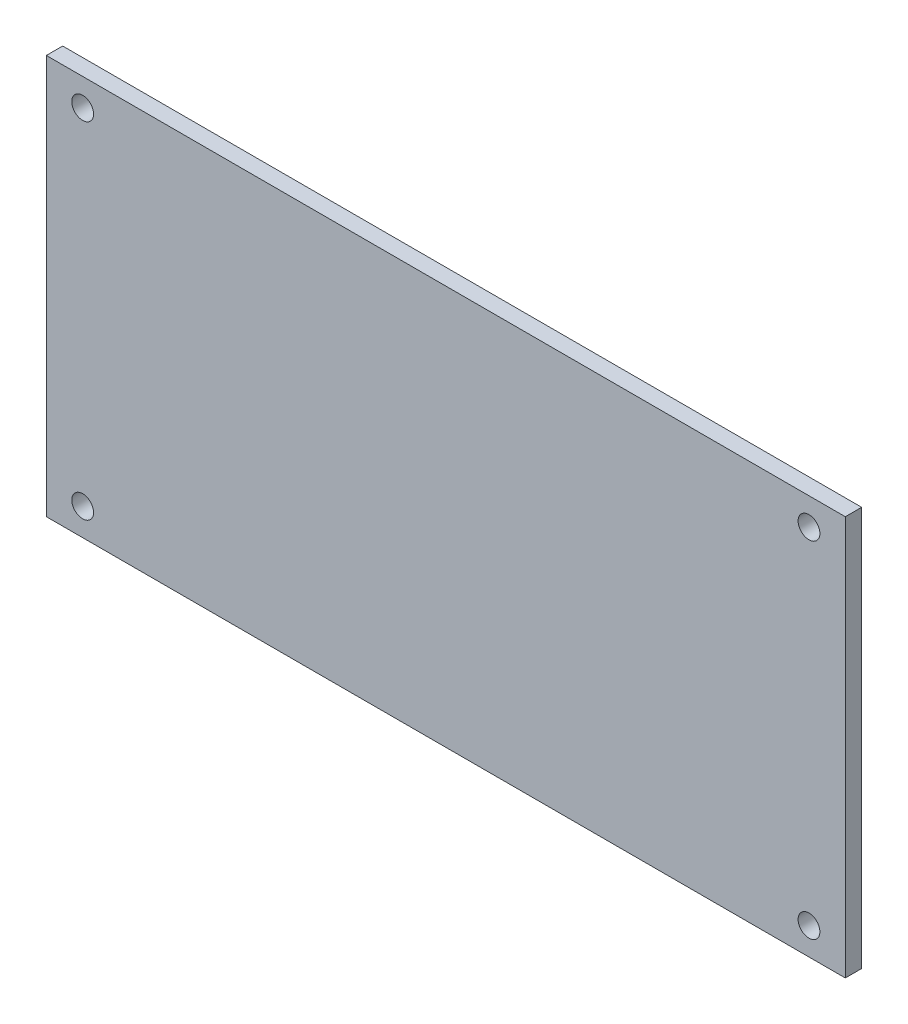
ISO-10303-21;
HEADER;
FILE_DESCRIPTION(('STEP AP214'),'2;1');
FILE_NAME('part.step','',(''),(''),'','','');
FILE_SCHEMA(('AUTOMOTIVE_DESIGN { 1 0 10303 214 1 1 1 1 }'));
ENDSEC;
DATA;
#1=APPLICATION_CONTEXT('core data for automotive mechanical design processes');
#2=APPLICATION_PROTOCOL_DEFINITION('international standard','automotive_design',2000,#1);
#3=PRODUCT_CONTEXT('',#1,'mechanical');
#4=PRODUCT('Part','Part','',(#3));
#5=PRODUCT_RELATED_PRODUCT_CATEGORY('part','',(#4));
#6=PRODUCT_DEFINITION_FORMATION('','',#4);
#7=PRODUCT_DEFINITION_CONTEXT('part definition',#1,'design');
#8=PRODUCT_DEFINITION('design','',#6,#7);
#9=PRODUCT_DEFINITION_SHAPE('','',#8);
#10=(LENGTH_UNIT() NAMED_UNIT(*) SI_UNIT(.MILLI.,.METRE.));
#11=(NAMED_UNIT(*) PLANE_ANGLE_UNIT() SI_UNIT($,.RADIAN.));
#12=(NAMED_UNIT(*) SI_UNIT($,.STERADIAN.) SOLID_ANGLE_UNIT());
#13=UNCERTAINTY_MEASURE_WITH_UNIT(LENGTH_MEASURE(1.E-05),#10,'distance_accuracy_value','');
#14=(GEOMETRIC_REPRESENTATION_CONTEXT(3) GLOBAL_UNCERTAINTY_ASSIGNED_CONTEXT((#13)) GLOBAL_UNIT_ASSIGNED_CONTEXT((#10,
#11,#12)) REPRESENTATION_CONTEXT('',''));
#15=CARTESIAN_POINT('',(0.,0.,0.));
#16=DIRECTION('',(0.,0.,1.));
#17=DIRECTION('',(1.,0.,0.));
#18=AXIS2_PLACEMENT_3D('',#15,#16,#17);
#19=CARTESIAN_POINT('',(0.,-27.5,2.25));
#20=DIRECTION('',(0.,1.,0.));
#21=DIRECTION('',(0.,0.,1.));
#22=AXIS2_PLACEMENT_3D('',#19,#20,#21);
#23=PLANE('',#22);
#24=DIRECTION('',(1.,0.,0.));
#25=VECTOR('',#24,1.);
#26=CARTESIAN_POINT('',(0.,-27.5,0.));
#27=LINE('',#26,#25);
#28=CARTESIAN_POINT('',(-55.,-27.5,0.));
#29=VERTEX_POINT('',#28);
#30=CARTESIAN_POINT('',(55.,-27.5,0.));
#31=VERTEX_POINT('',#30);
#32=EDGE_CURVE('E113',#29,#31,#27,.T.);
#33=ORIENTED_EDGE('',*,*,#32,.T.);
#34=DIRECTION('',(0.,0.,-1.));
#35=VECTOR('',#34,1.);
#36=CARTESIAN_POINT('',(55.,-27.5,2.25));
#37=LINE('',#36,#35);
#38=CARTESIAN_POINT('',(55.,-27.5,2.25));
#39=VERTEX_POINT('',#38);
#40=EDGE_CURVE('E11',#39,#31,#37,.T.);
#41=ORIENTED_EDGE('',*,*,#40,.F.);
#42=DIRECTION('',(1.,0.,0.));
#43=VECTOR('',#42,1.);
#44=CARTESIAN_POINT('',(0.,-27.5,2.25));
#45=LINE('',#44,#43);
#46=CARTESIAN_POINT('',(-55.,-27.5,2.25));
#47=VERTEX_POINT('',#46);
#48=EDGE_CURVE('E87',#47,#39,#45,.T.);
#49=ORIENTED_EDGE('',*,*,#48,.F.);
#50=DIRECTION('',(0.,0.,-1.));
#51=VECTOR('',#50,1.);
#52=CARTESIAN_POINT('',(-55.,-27.5,2.25));
#53=LINE('',#52,#51);
#54=EDGE_CURVE('E53',#47,#29,#53,.T.);
#55=ORIENTED_EDGE('',*,*,#54,.T.);
#56=EDGE_LOOP('',(#33,#41,#49,#55));
#57=FACE_BOUND('',#56,.T.);
#58=ADVANCED_FACE('F36',(#57),#23,.F.);
#59=CARTESIAN_POINT('',(55.,0.,2.25));
#60=DIRECTION('',(-1.,0.,0.));
#61=DIRECTION('',(0.,0.,1.));
#62=AXIS2_PLACEMENT_3D('',#59,#60,#61);
#63=PLANE('',#62);
#64=DIRECTION('',(0.,1.,0.));
#65=VECTOR('',#64,1.);
#66=CARTESIAN_POINT('',(55.,0.,0.));
#67=LINE('',#66,#65);
#68=CARTESIAN_POINT('',(55.,27.5,0.));
#69=VERTEX_POINT('',#68);
#70=EDGE_CURVE('E92',#31,#69,#67,.T.);
#71=ORIENTED_EDGE('',*,*,#70,.T.);
#72=DIRECTION('',(0.,0.,-1.));
#73=VECTOR('',#72,1.);
#74=CARTESIAN_POINT('',(55.,27.5,2.25));
#75=LINE('',#74,#73);
#76=CARTESIAN_POINT('',(55.,27.5,2.25));
#77=VERTEX_POINT('',#76);
#78=EDGE_CURVE('E45',#77,#69,#75,.T.);
#79=ORIENTED_EDGE('',*,*,#78,.F.);
#80=DIRECTION('',(0.,1.,0.));
#81=VECTOR('',#80,1.);
#82=CARTESIAN_POINT('',(55.,0.,2.25));
#83=LINE('',#82,#81);
#84=EDGE_CURVE('E78',#39,#77,#83,.T.);
#85=ORIENTED_EDGE('',*,*,#84,.F.);
#86=ORIENTED_EDGE('',*,*,#40,.T.);
#87=EDGE_LOOP('',(#71,#79,#85,#86));
#88=FACE_BOUND('',#87,.T.);
#89=ADVANCED_FACE('F91',(#88),#63,.F.);
#90=CARTESIAN_POINT('',(0.,27.5,2.25));
#91=DIRECTION('',(0.,1.,0.));
#92=DIRECTION('',(0.,0.,1.));
#93=AXIS2_PLACEMENT_3D('',#90,#91,#92);
#94=PLANE('',#93);
#95=DIRECTION('',(1.,0.,0.));
#96=VECTOR('',#95,1.);
#97=CARTESIAN_POINT('',(0.,27.5,0.));
#98=LINE('',#97,#96);
#99=CARTESIAN_POINT('',(-55.,27.5,0.));
#100=VERTEX_POINT('',#99);
#101=EDGE_CURVE('E116',#100,#69,#98,.T.);
#102=ORIENTED_EDGE('',*,*,#101,.F.);
#103=DIRECTION('',(0.,0.,-1.));
#104=VECTOR('',#103,1.);
#105=CARTESIAN_POINT('',(-55.,27.5,2.25));
#106=LINE('',#105,#104);
#107=CARTESIAN_POINT('',(-55.,27.5,2.25));
#108=VERTEX_POINT('',#107);
#109=EDGE_CURVE('E67',#108,#100,#106,.T.);
#110=ORIENTED_EDGE('',*,*,#109,.F.);
#111=DIRECTION('',(1.,0.,0.));
#112=VECTOR('',#111,1.);
#113=CARTESIAN_POINT('',(0.,27.5,2.25));
#114=LINE('',#113,#112);
#115=EDGE_CURVE('E86',#108,#77,#114,.T.);
#116=ORIENTED_EDGE('',*,*,#115,.T.);
#117=ORIENTED_EDGE('',*,*,#78,.T.);
#118=EDGE_LOOP('',(#102,#110,#116,#117));
#119=FACE_BOUND('',#118,.T.);
#120=ADVANCED_FACE('F95',(#119),#94,.T.);
#121=CARTESIAN_POINT('',(50.,-23.75,2.25));
#122=DIRECTION('',(0.,0.,-1.));
#123=DIRECTION('',(-1.,0.,0.));
#124=AXIS2_PLACEMENT_3D('',#121,#122,#123);
#125=CYLINDRICAL_SURFACE('',#124,1.5);
#126=CARTESIAN_POINT('',(50.,-23.75,2.25));
#127=DIRECTION('',(0.,0.,1.));
#128=DIRECTION('',(1.,0.,0.));
#129=AXIS2_PLACEMENT_3D('',#126,#127,#128);
#130=CIRCLE('',#129,1.5);
#131=CARTESIAN_POINT('',(51.5,-23.75,2.25));
#132=VERTEX_POINT('',#131);
#133=EDGE_CURVE('E98',#132,#132,#130,.T.);
#134=ORIENTED_EDGE('',*,*,#133,.T.);
#135=EDGE_LOOP('',(#134));
#136=FACE_BOUND('',#135,.T.);
#137=CARTESIAN_POINT('',(50.,-23.75,0.));
#138=DIRECTION('',(0.,0.,1.));
#139=DIRECTION('',(1.,0.,0.));
#140=AXIS2_PLACEMENT_3D('',#137,#138,#139);
#141=CIRCLE('',#140,1.5);
#142=CARTESIAN_POINT('',(51.5,-23.75,0.));
#143=VERTEX_POINT('',#142);
#144=EDGE_CURVE('E121',#143,#143,#141,.T.);
#145=ORIENTED_EDGE('',*,*,#144,.F.);
#146=EDGE_LOOP('',(#145));
#147=FACE_BOUND('',#146,.T.);
#148=ADVANCED_FACE('F169',(#136,#147),#125,.F.);
#149=CARTESIAN_POINT('',(-55.,0.,2.25));
#150=DIRECTION('',(-1.,0.,0.));
#151=DIRECTION('',(0.,0.,1.));
#152=AXIS2_PLACEMENT_3D('',#149,#150,#151);
#153=PLANE('',#152);
#154=DIRECTION('',(0.,1.,0.));
#155=VECTOR('',#154,1.);
#156=CARTESIAN_POINT('',(-55.,0.,0.));
#157=LINE('',#156,#155);
#158=EDGE_CURVE('E118',#29,#100,#157,.T.);
#159=ORIENTED_EDGE('',*,*,#158,.F.);
#160=ORIENTED_EDGE('',*,*,#54,.F.);
#161=DIRECTION('',(0.,1.,0.));
#162=VECTOR('',#161,1.);
#163=CARTESIAN_POINT('',(-55.,0.,2.25));
#164=LINE('',#163,#162);
#165=EDGE_CURVE('E96',#47,#108,#164,.T.);
#166=ORIENTED_EDGE('',*,*,#165,.T.);
#167=ORIENTED_EDGE('',*,*,#109,.T.);
#168=EDGE_LOOP('',(#159,#160,#166,#167));
#169=FACE_BOUND('',#168,.T.);
#170=ADVANCED_FACE('F163',(#169),#153,.T.);
#171=CARTESIAN_POINT('',(-50.,23.75,2.25));
#172=DIRECTION('',(0.,0.,-1.));
#173=DIRECTION('',(-1.,0.,0.));
#174=AXIS2_PLACEMENT_3D('',#171,#172,#173);
#175=CYLINDRICAL_SURFACE('',#174,1.5);
#176=CARTESIAN_POINT('',(-50.,23.75,2.25));
#177=DIRECTION('',(0.,0.,1.));
#178=DIRECTION('',(1.,0.,0.));
#179=AXIS2_PLACEMENT_3D('',#176,#177,#178);
#180=CIRCLE('',#179,1.5);
#181=CARTESIAN_POINT('',(-48.5,23.75,2.25));
#182=VERTEX_POINT('',#181);
#183=EDGE_CURVE('E132',#182,#182,#180,.T.);
#184=ORIENTED_EDGE('',*,*,#183,.T.);
#185=EDGE_LOOP('',(#184));
#186=FACE_BOUND('',#185,.T.);
#187=CARTESIAN_POINT('',(-50.,23.75,0.));
#188=DIRECTION('',(0.,0.,1.));
#189=DIRECTION('',(1.,0.,0.));
#190=AXIS2_PLACEMENT_3D('',#187,#188,#189);
#191=CIRCLE('',#190,1.5);
#192=CARTESIAN_POINT('',(-48.5,23.75,0.));
#193=VERTEX_POINT('',#192);
#194=EDGE_CURVE('E110',#193,#193,#191,.T.);
#195=ORIENTED_EDGE('',*,*,#194,.F.);
#196=EDGE_LOOP('',(#195));
#197=FACE_BOUND('',#196,.T.);
#198=ADVANCED_FACE('F140',(#186,#197),#175,.F.);
#199=CARTESIAN_POINT('',(-50.,-23.75,2.25));
#200=DIRECTION('',(0.,0.,-1.));
#201=DIRECTION('',(-1.,0.,0.));
#202=AXIS2_PLACEMENT_3D('',#199,#200,#201);
#203=CYLINDRICAL_SURFACE('',#202,1.5);
#204=CARTESIAN_POINT('',(-50.,-23.75,2.25));
#205=DIRECTION('',(0.,0.,1.));
#206=DIRECTION('',(1.,0.,0.));
#207=AXIS2_PLACEMENT_3D('',#204,#205,#206);
#208=CIRCLE('',#207,1.5);
#209=CARTESIAN_POINT('',(-48.5,-23.75,2.25));
#210=VERTEX_POINT('',#209);
#211=EDGE_CURVE('E127',#210,#210,#208,.F.);
#212=ORIENTED_EDGE('',*,*,#211,.F.);
#213=EDGE_LOOP('',(#212));
#214=FACE_BOUND('',#213,.T.);
#215=CARTESIAN_POINT('',(-50.,-23.75,0.));
#216=DIRECTION('',(0.,0.,1.));
#217=DIRECTION('',(1.,0.,0.));
#218=AXIS2_PLACEMENT_3D('',#215,#216,#217);
#219=CIRCLE('',#218,1.5);
#220=CARTESIAN_POINT('',(-48.5,-23.75,0.));
#221=VERTEX_POINT('',#220);
#222=EDGE_CURVE('E107',#221,#221,#219,.F.);
#223=ORIENTED_EDGE('',*,*,#222,.T.);
#224=EDGE_LOOP('',(#223));
#225=FACE_BOUND('',#224,.T.);
#226=ADVANCED_FACE('F38',(#214,#225),#203,.F.);
#227=CARTESIAN_POINT('',(50.,23.75,2.25));
#228=DIRECTION('',(0.,0.,-1.));
#229=DIRECTION('',(-1.,0.,0.));
#230=AXIS2_PLACEMENT_3D('',#227,#228,#229);
#231=CYLINDRICAL_SURFACE('',#230,1.5);
#232=CARTESIAN_POINT('',(50.,23.75,2.25));
#233=DIRECTION('',(0.,0.,1.));
#234=DIRECTION('',(1.,0.,0.));
#235=AXIS2_PLACEMENT_3D('',#232,#233,#234);
#236=CIRCLE('',#235,1.5);
#237=CARTESIAN_POINT('',(51.5,23.75,2.25));
#238=VERTEX_POINT('',#237);
#239=EDGE_CURVE('E104',#238,#238,#236,.F.);
#240=ORIENTED_EDGE('',*,*,#239,.F.);
#241=EDGE_LOOP('',(#240));
#242=FACE_BOUND('',#241,.T.);
#243=CARTESIAN_POINT('',(50.,23.75,0.));
#244=DIRECTION('',(0.,0.,1.));
#245=DIRECTION('',(1.,0.,0.));
#246=AXIS2_PLACEMENT_3D('',#243,#244,#245);
#247=CIRCLE('',#246,1.5);
#248=CARTESIAN_POINT('',(51.5,23.75,0.));
#249=VERTEX_POINT('',#248);
#250=EDGE_CURVE('E124',#249,#249,#247,.F.);
#251=ORIENTED_EDGE('',*,*,#250,.T.);
#252=EDGE_LOOP('',(#251));
#253=FACE_BOUND('',#252,.T.);
#254=ADVANCED_FACE('F145',(#242,#253),#231,.F.);
#255=CARTESIAN_POINT('',(0.,0.,2.25));
#256=DIRECTION('',(0.,0.,1.));
#257=DIRECTION('',(1.,0.,0.));
#258=AXIS2_PLACEMENT_3D('',#255,#256,#257);
#259=PLANE('',#258);
#260=ORIENTED_EDGE('',*,*,#211,.T.);
#261=EDGE_LOOP('',(#260));
#262=FACE_BOUND('',#261,.T.);
#263=ORIENTED_EDGE('',*,*,#183,.F.);
#264=EDGE_LOOP('',(#263));
#265=FACE_BOUND('',#264,.T.);
#266=ORIENTED_EDGE('',*,*,#48,.T.);
#267=ORIENTED_EDGE('',*,*,#84,.T.);
#268=ORIENTED_EDGE('',*,*,#115,.F.);
#269=ORIENTED_EDGE('',*,*,#165,.F.);
#270=EDGE_LOOP('',(#266,#267,#268,#269));
#271=FACE_BOUND('',#270,.T.);
#272=ORIENTED_EDGE('',*,*,#133,.F.);
#273=EDGE_LOOP('',(#272));
#274=FACE_BOUND('',#273,.T.);
#275=ORIENTED_EDGE('',*,*,#239,.T.);
#276=EDGE_LOOP('',(#275));
#277=FACE_BOUND('',#276,.T.);
#278=ADVANCED_FACE('F82',(#262,#265,#271,#274,#277),#259,.T.);
#279=CARTESIAN_POINT('',(0.,0.,0.));
#280=DIRECTION('',(0.,0.,1.));
#281=DIRECTION('',(1.,0.,0.));
#282=AXIS2_PLACEMENT_3D('',#279,#280,#281);
#283=PLANE('',#282);
#284=ORIENTED_EDGE('',*,*,#222,.F.);
#285=EDGE_LOOP('',(#284));
#286=FACE_BOUND('',#285,.T.);
#287=ORIENTED_EDGE('',*,*,#194,.T.);
#288=EDGE_LOOP('',(#287));
#289=FACE_BOUND('',#288,.T.);
#290=ORIENTED_EDGE('',*,*,#32,.F.);
#291=ORIENTED_EDGE('',*,*,#158,.T.);
#292=ORIENTED_EDGE('',*,*,#101,.T.);
#293=ORIENTED_EDGE('',*,*,#70,.F.);
#294=EDGE_LOOP('',(#290,#291,#292,#293));
#295=FACE_BOUND('',#294,.T.);
#296=ORIENTED_EDGE('',*,*,#144,.T.);
#297=EDGE_LOOP('',(#296));
#298=FACE_BOUND('',#297,.T.);
#299=ORIENTED_EDGE('',*,*,#250,.F.);
#300=EDGE_LOOP('',(#299));
#301=FACE_BOUND('',#300,.T.);
#302=ADVANCED_FACE('F144',(#286,#289,#295,#298,#301),#283,.F.);
#303=CLOSED_SHELL('',(#58,#89,#120,#148,#170,#198,#226,#254,#278,#302));
#304=MANIFOLD_SOLID_BREP('B2',#303);
#305=ADVANCED_BREP_SHAPE_REPRESENTATION('',(#18,#304),#14);
#306=SHAPE_DEFINITION_REPRESENTATION(#9,#305);
ENDSEC;
END-ISO-10303-21;
